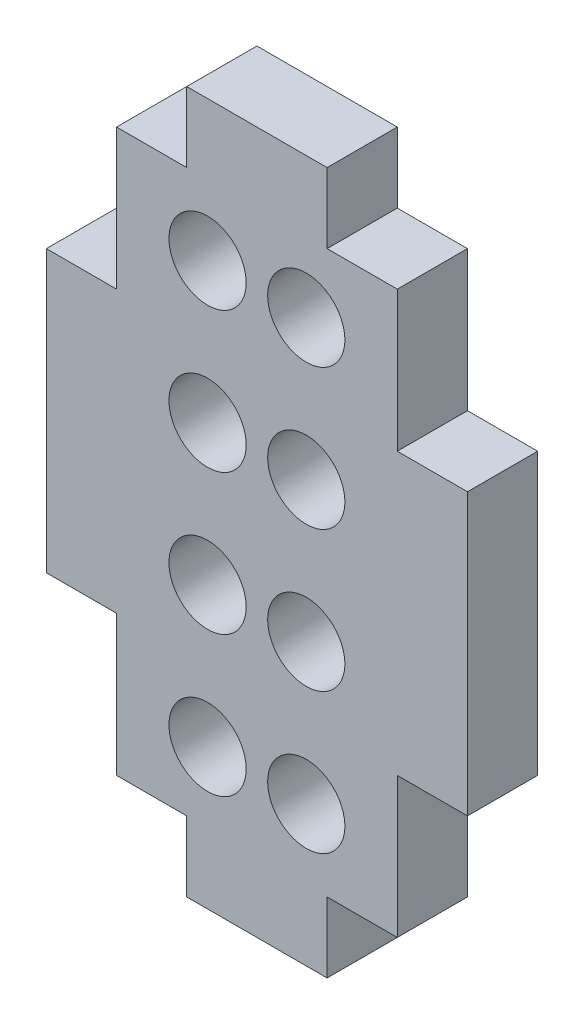
ISO-10303-21;
HEADER;
FILE_DESCRIPTION(('STEP AP214'),'2;1');
FILE_NAME('part.step','',(''),(''),'','','');
FILE_SCHEMA(('AUTOMOTIVE_DESIGN { 1 0 10303 214 1 1 1 1 }'));
ENDSEC;
DATA;
#1=APPLICATION_CONTEXT('core data for automotive mechanical design processes');
#2=APPLICATION_PROTOCOL_DEFINITION('international standard','automotive_design',2000,#1);
#3=PRODUCT_CONTEXT('',#1,'mechanical');
#4=PRODUCT('Part','Part','',(#3));
#5=PRODUCT_RELATED_PRODUCT_CATEGORY('part','',(#4));
#6=PRODUCT_DEFINITION_FORMATION('','',#4);
#7=PRODUCT_DEFINITION_CONTEXT('part definition',#1,'design');
#8=PRODUCT_DEFINITION('design','',#6,#7);
#9=PRODUCT_DEFINITION_SHAPE('','',#8);
#10=(LENGTH_UNIT() NAMED_UNIT(*) SI_UNIT(.MILLI.,.METRE.));
#11=(NAMED_UNIT(*) PLANE_ANGLE_UNIT() SI_UNIT($,.RADIAN.));
#12=(NAMED_UNIT(*) SI_UNIT($,.STERADIAN.) SOLID_ANGLE_UNIT());
#13=UNCERTAINTY_MEASURE_WITH_UNIT(LENGTH_MEASURE(1.E-05),#10,'distance_accuracy_value','');
#14=(GEOMETRIC_REPRESENTATION_CONTEXT(3) GLOBAL_UNCERTAINTY_ASSIGNED_CONTEXT((#13)) GLOBAL_UNIT_ASSIGNED_CONTEXT((#10,
#11,#12)) REPRESENTATION_CONTEXT('',''));
#15=CARTESIAN_POINT('',(0.,0.,0.));
#16=DIRECTION('',(0.,0.,1.));
#17=DIRECTION('',(1.,0.,0.));
#18=AXIS2_PLACEMENT_3D('',#15,#16,#17);
#19=CARTESIAN_POINT('',(12.9990004631941,5.51527459755107,5.));
#20=DIRECTION('',(0.,-1.,0.));
#21=DIRECTION('',(0.,0.,-1.));
#22=AXIS2_PLACEMENT_3D('',#19,#20,#21);
#23=PLANE('',#22);
#24=DIRECTION('',(-1.,0.,0.));
#25=VECTOR('',#24,1.);
#26=CARTESIAN_POINT('',(12.9990004631941,5.51527459755107,0.));
#27=LINE('',#26,#25);
#28=CARTESIAN_POINT('',(17.9990004631941,5.51527459755107,0.));
#29=VERTEX_POINT('',#28);
#30=CARTESIAN_POINT('',(12.9990004631941,5.51527459755107,0.));
#31=VERTEX_POINT('',#30);
#32=EDGE_CURVE('E216',#29,#31,#27,.T.);
#33=ORIENTED_EDGE('',*,*,#32,.T.);
#34=DIRECTION('',(0.,0.,-1.));
#35=VECTOR('',#34,1.);
#36=CARTESIAN_POINT('',(12.9990004631941,5.51527459755107,5.));
#37=LINE('',#36,#35);
#38=CARTESIAN_POINT('',(12.9990004631941,5.51527459755107,5.));
#39=VERTEX_POINT('',#38);
#40=EDGE_CURVE('E11',#39,#31,#37,.T.);
#41=ORIENTED_EDGE('',*,*,#40,.F.);
#42=DIRECTION('',(-1.,0.,0.));
#43=VECTOR('',#42,1.);
#44=CARTESIAN_POINT('',(12.9990004631941,5.51527459755107,5.));
#45=LINE('',#44,#43);
#46=CARTESIAN_POINT('',(17.9990004631941,5.51527459755107,5.));
#47=VERTEX_POINT('',#46);
#48=EDGE_CURVE('E275',#47,#39,#45,.T.);
#49=ORIENTED_EDGE('',*,*,#48,.F.);
#50=DIRECTION('',(0.,0.,-1.));
#51=VECTOR('',#50,1.);
#52=CARTESIAN_POINT('',(17.9990004631941,5.51527459755107,5.));
#53=LINE('',#52,#51);
#54=EDGE_CURVE('E212',#47,#29,#53,.T.);
#55=ORIENTED_EDGE('',*,*,#54,.T.);
#56=EDGE_LOOP('',(#33,#41,#49,#55));
#57=FACE_BOUND('',#56,.T.);
#58=ADVANCED_FACE('F43',(#57),#23,.F.);
#59=CARTESIAN_POINT('',(12.9990004631941,-14.4847254024489,5.));
#60=DIRECTION('',(1.,0.,0.));
#61=DIRECTION('',(0.,0.,-1.));
#62=AXIS2_PLACEMENT_3D('',#59,#60,#61);
#63=PLANE('',#62);
#64=DIRECTION('',(0.,-1.,0.));
#65=VECTOR('',#64,1.);
#66=CARTESIAN_POINT('',(12.9990004631941,-14.4847254024489,0.));
#67=LINE('',#66,#65);
#68=CARTESIAN_POINT('',(12.9990004631941,-14.4847254024489,0.));
#69=VERTEX_POINT('',#68);
#70=EDGE_CURVE('E220',#31,#69,#67,.T.);
#71=ORIENTED_EDGE('',*,*,#70,.T.);
#72=DIRECTION('',(0.,0.,-1.));
#73=VECTOR('',#72,1.);
#74=CARTESIAN_POINT('',(12.9990004631941,-14.4847254024489,5.));
#75=LINE('',#74,#73);
#76=CARTESIAN_POINT('',(12.9990004631941,-14.4847254024489,5.));
#77=VERTEX_POINT('',#76);
#78=EDGE_CURVE('E52',#77,#69,#75,.T.);
#79=ORIENTED_EDGE('',*,*,#78,.F.);
#80=DIRECTION('',(0.,-1.,0.));
#81=VECTOR('',#80,1.);
#82=CARTESIAN_POINT('',(12.9990004631941,-14.4847254024489,5.));
#83=LINE('',#82,#81);
#84=EDGE_CURVE('E139',#39,#77,#83,.T.);
#85=ORIENTED_EDGE('',*,*,#84,.F.);
#86=ORIENTED_EDGE('',*,*,#40,.T.);
#87=EDGE_LOOP('',(#71,#79,#85,#86));
#88=FACE_BOUND('',#87,.T.);
#89=ADVANCED_FACE('F426',(#88),#63,.F.);
#90=CARTESIAN_POINT('',(17.9990004631941,-14.4847254024489,5.));
#91=DIRECTION('',(0.,1.,0.));
#92=DIRECTION('',(0.,0.,1.));
#93=AXIS2_PLACEMENT_3D('',#90,#91,#92);
#94=PLANE('',#93);
#95=DIRECTION('',(1.,0.,0.));
#96=VECTOR('',#95,1.);
#97=CARTESIAN_POINT('',(17.9990004631941,-14.4847254024489,0.));
#98=LINE('',#97,#96);
#99=CARTESIAN_POINT('',(17.9990004631941,-14.4847254024489,0.));
#100=VERTEX_POINT('',#99);
#101=EDGE_CURVE('E224',#69,#100,#98,.T.);
#102=ORIENTED_EDGE('',*,*,#101,.T.);
#103=DIRECTION('',(0.,0.,-1.));
#104=VECTOR('',#103,1.);
#105=CARTESIAN_POINT('',(17.9990004631941,-14.4847254024489,5.));
#106=LINE('',#105,#104);
#107=CARTESIAN_POINT('',(17.9990004631941,-14.4847254024489,5.));
#108=VERTEX_POINT('',#107);
#109=EDGE_CURVE('E334',#108,#100,#106,.T.);
#110=ORIENTED_EDGE('',*,*,#109,.F.);
#111=DIRECTION('',(1.,0.,0.));
#112=VECTOR('',#111,1.);
#113=CARTESIAN_POINT('',(17.9990004631941,-14.4847254024489,5.));
#114=LINE('',#113,#112);
#115=EDGE_CURVE('E344',#77,#108,#114,.T.);
#116=ORIENTED_EDGE('',*,*,#115,.F.);
#117=ORIENTED_EDGE('',*,*,#78,.T.);
#118=EDGE_LOOP('',(#102,#110,#116,#117));
#119=FACE_BOUND('',#118,.T.);
#120=ADVANCED_FACE('F342',(#119),#94,.F.);
#121=CARTESIAN_POINT('',(17.9990004631941,-24.4847254024489,5.));
#122=DIRECTION('',(1.,0.,0.));
#123=DIRECTION('',(0.,0.,-1.));
#124=AXIS2_PLACEMENT_3D('',#121,#122,#123);
#125=PLANE('',#124);
#126=DIRECTION('',(0.,-1.,0.));
#127=VECTOR('',#126,1.);
#128=CARTESIAN_POINT('',(17.9990004631941,-24.4847254024489,0.));
#129=LINE('',#128,#127);
#130=CARTESIAN_POINT('',(17.9990004631941,-24.4847254024489,0.));
#131=VERTEX_POINT('',#130);
#132=EDGE_CURVE('E227',#100,#131,#129,.T.);
#133=ORIENTED_EDGE('',*,*,#132,.T.);
#134=DIRECTION('',(0.,0.,-1.));
#135=VECTOR('',#134,1.);
#136=CARTESIAN_POINT('',(17.9990004631941,-24.4847254024489,5.));
#137=LINE('',#136,#135);
#138=CARTESIAN_POINT('',(17.9990004631941,-24.4847254024489,5.));
#139=VERTEX_POINT('',#138);
#140=EDGE_CURVE('E330',#139,#131,#137,.T.);
#141=ORIENTED_EDGE('',*,*,#140,.F.);
#142=DIRECTION('',(0.,-1.,0.));
#143=VECTOR('',#142,1.);
#144=CARTESIAN_POINT('',(17.9990004631941,-24.4847254024489,5.));
#145=LINE('',#144,#143);
#146=EDGE_CURVE('E363',#108,#139,#145,.T.);
#147=ORIENTED_EDGE('',*,*,#146,.F.);
#148=ORIENTED_EDGE('',*,*,#109,.T.);
#149=EDGE_LOOP('',(#133,#141,#147,#148));
#150=FACE_BOUND('',#149,.T.);
#151=ADVANCED_FACE('F353',(#150),#125,.F.);
#152=CARTESIAN_POINT('',(22.9990004631945,-24.4847254024489,5.));
#153=DIRECTION('',(0.,1.,0.));
#154=DIRECTION('',(0.,0.,1.));
#155=AXIS2_PLACEMENT_3D('',#152,#153,#154);
#156=PLANE('',#155);
#157=DIRECTION('',(1.,0.,0.));
#158=VECTOR('',#157,1.);
#159=CARTESIAN_POINT('',(22.9990004631945,-24.4847254024489,0.));
#160=LINE('',#159,#158);
#161=CARTESIAN_POINT('',(22.9990004631945,-24.4847254024489,0.));
#162=VERTEX_POINT('',#161);
#163=EDGE_CURVE('E230',#131,#162,#160,.T.);
#164=ORIENTED_EDGE('',*,*,#163,.T.);
#165=DIRECTION('',(0.,0.,-1.));
#166=VECTOR('',#165,1.);
#167=CARTESIAN_POINT('',(22.9990004631945,-24.4847254024489,5.));
#168=LINE('',#167,#166);
#169=CARTESIAN_POINT('',(22.9990004631945,-24.4847254024489,5.));
#170=VERTEX_POINT('',#169);
#171=EDGE_CURVE('E326',#170,#162,#168,.T.);
#172=ORIENTED_EDGE('',*,*,#171,.F.);
#173=DIRECTION('',(1.,0.,0.));
#174=VECTOR('',#173,1.);
#175=CARTESIAN_POINT('',(22.9990004631945,-24.4847254024489,5.));
#176=LINE('',#175,#174);
#177=EDGE_CURVE('E359',#139,#170,#176,.T.);
#178=ORIENTED_EDGE('',*,*,#177,.F.);
#179=ORIENTED_EDGE('',*,*,#140,.T.);
#180=EDGE_LOOP('',(#164,#172,#178,#179));
#181=FACE_BOUND('',#180,.T.);
#182=ADVANCED_FACE('F357',(#181),#156,.F.);
#183=CARTESIAN_POINT('',(22.9990004631945,-29.4847254024489,5.));
#184=DIRECTION('',(1.,0.,0.));
#185=DIRECTION('',(0.,0.,-1.));
#186=AXIS2_PLACEMENT_3D('',#183,#184,#185);
#187=PLANE('',#186);
#188=DIRECTION('',(0.,-1.,0.));
#189=VECTOR('',#188,1.);
#190=CARTESIAN_POINT('',(22.9990004631945,-29.4847254024489,0.));
#191=LINE('',#190,#189);
#192=CARTESIAN_POINT('',(22.9990004631945,-29.4847254024489,0.));
#193=VERTEX_POINT('',#192);
#194=EDGE_CURVE('E233',#162,#193,#191,.T.);
#195=ORIENTED_EDGE('',*,*,#194,.T.);
#196=DIRECTION('',(0.,0.,-1.));
#197=VECTOR('',#196,1.);
#198=CARTESIAN_POINT('',(22.9990004631945,-29.4847254024489,5.));
#199=LINE('',#198,#197);
#200=CARTESIAN_POINT('',(22.9990004631945,-29.4847254024489,5.));
#201=VERTEX_POINT('',#200);
#202=EDGE_CURVE('E322',#201,#193,#199,.T.);
#203=ORIENTED_EDGE('',*,*,#202,.F.);
#204=DIRECTION('',(0.,-1.,0.));
#205=VECTOR('',#204,1.);
#206=CARTESIAN_POINT('',(22.9990004631945,-29.4847254024489,5.));
#207=LINE('',#206,#205);
#208=EDGE_CURVE('E362',#170,#201,#207,.T.);
#209=ORIENTED_EDGE('',*,*,#208,.F.);
#210=ORIENTED_EDGE('',*,*,#171,.T.);
#211=EDGE_LOOP('',(#195,#203,#209,#210));
#212=FACE_BOUND('',#211,.T.);
#213=ADVANCED_FACE('F439',(#212),#187,.F.);
#214=CARTESIAN_POINT('',(22.9990004631945,-29.4847254024489,5.));
#215=DIRECTION('',(0.,1.,0.));
#216=DIRECTION('',(0.,0.,1.));
#217=AXIS2_PLACEMENT_3D('',#214,#215,#216);
#218=PLANE('',#217);
#219=DIRECTION('',(1.,0.,0.));
#220=VECTOR('',#219,1.);
#221=CARTESIAN_POINT('',(22.9990004631945,-29.4847254024489,0.));
#222=LINE('',#221,#220);
#223=CARTESIAN_POINT('',(32.9990004631945,-29.4847254024489,0.));
#224=VERTEX_POINT('',#223);
#225=EDGE_CURVE('E236',#193,#224,#222,.T.);
#226=ORIENTED_EDGE('',*,*,#225,.T.);
#227=DIRECTION('',(0.,0.,-1.));
#228=VECTOR('',#227,1.);
#229=CARTESIAN_POINT('',(32.9990004631945,-29.4847254024489,5.));
#230=LINE('',#229,#228);
#231=CARTESIAN_POINT('',(32.9990004631945,-29.4847254024489,5.));
#232=VERTEX_POINT('',#231);
#233=EDGE_CURVE('E318',#232,#224,#230,.T.);
#234=ORIENTED_EDGE('',*,*,#233,.F.);
#235=DIRECTION('',(1.,0.,0.));
#236=VECTOR('',#235,1.);
#237=CARTESIAN_POINT('',(22.9990004631945,-29.4847254024489,5.));
#238=LINE('',#237,#236);
#239=EDGE_CURVE('E367',#201,#232,#238,.T.);
#240=ORIENTED_EDGE('',*,*,#239,.F.);
#241=ORIENTED_EDGE('',*,*,#202,.T.);
#242=EDGE_LOOP('',(#226,#234,#240,#241));
#243=FACE_BOUND('',#242,.T.);
#244=ADVANCED_FACE('F442',(#243),#218,.F.);
#245=CARTESIAN_POINT('',(32.9990004631945,-24.4847254024489,5.));
#246=DIRECTION('',(-1.,0.,0.));
#247=DIRECTION('',(0.,0.,1.));
#248=AXIS2_PLACEMENT_3D('',#245,#246,#247);
#249=PLANE('',#248);
#250=DIRECTION('',(0.,1.,0.));
#251=VECTOR('',#250,1.);
#252=CARTESIAN_POINT('',(32.9990004631945,-24.4847254024489,0.));
#253=LINE('',#252,#251);
#254=CARTESIAN_POINT('',(32.9990004631945,-24.4847254024489,0.));
#255=VERTEX_POINT('',#254);
#256=EDGE_CURVE('E239',#224,#255,#253,.T.);
#257=ORIENTED_EDGE('',*,*,#256,.T.);
#258=DIRECTION('',(0.,0.,-1.));
#259=VECTOR('',#258,1.);
#260=CARTESIAN_POINT('',(32.9990004631945,-24.4847254024489,5.));
#261=LINE('',#260,#259);
#262=CARTESIAN_POINT('',(32.9990004631945,-24.4847254024489,5.));
#263=VERTEX_POINT('',#262);
#264=EDGE_CURVE('E314',#263,#255,#261,.T.);
#265=ORIENTED_EDGE('',*,*,#264,.F.);
#266=DIRECTION('',(0.,1.,0.));
#267=VECTOR('',#266,1.);
#268=CARTESIAN_POINT('',(32.9990004631945,-24.4847254024489,5.));
#269=LINE('',#268,#267);
#270=EDGE_CURVE('E374',#232,#263,#269,.T.);
#271=ORIENTED_EDGE('',*,*,#270,.F.);
#272=ORIENTED_EDGE('',*,*,#233,.T.);
#273=EDGE_LOOP('',(#257,#265,#271,#272));
#274=FACE_BOUND('',#273,.T.);
#275=ADVANCED_FACE('F446',(#274),#249,.F.);
#276=CARTESIAN_POINT('',(37.9990004631941,-24.4847254024489,5.));
#277=DIRECTION('',(0.,1.,0.));
#278=DIRECTION('',(0.,0.,1.));
#279=AXIS2_PLACEMENT_3D('',#276,#277,#278);
#280=PLANE('',#279);
#281=DIRECTION('',(1.,0.,0.));
#282=VECTOR('',#281,1.);
#283=CARTESIAN_POINT('',(37.9990004631941,-24.4847254024489,0.));
#284=LINE('',#283,#282);
#285=CARTESIAN_POINT('',(37.9990004631941,-24.4847254024489,0.));
#286=VERTEX_POINT('',#285);
#287=EDGE_CURVE('E242',#255,#286,#284,.T.);
#288=ORIENTED_EDGE('',*,*,#287,.T.);
#289=DIRECTION('',(0.,0.,-1.));
#290=VECTOR('',#289,1.);
#291=CARTESIAN_POINT('',(37.9990004631941,-24.4847254024489,5.));
#292=LINE('',#291,#290);
#293=CARTESIAN_POINT('',(37.9990004631941,-24.4847254024489,5.));
#294=VERTEX_POINT('',#293);
#295=EDGE_CURVE('E310',#294,#286,#292,.T.);
#296=ORIENTED_EDGE('',*,*,#295,.F.);
#297=DIRECTION('',(1.,0.,0.));
#298=VECTOR('',#297,1.);
#299=CARTESIAN_POINT('',(37.9990004631941,-24.4847254024489,5.));
#300=LINE('',#299,#298);
#301=EDGE_CURVE('E377',#263,#294,#300,.T.);
#302=ORIENTED_EDGE('',*,*,#301,.F.);
#303=ORIENTED_EDGE('',*,*,#264,.T.);
#304=EDGE_LOOP('',(#288,#296,#302,#303));
#305=FACE_BOUND('',#304,.T.);
#306=ADVANCED_FACE('F450',(#305),#280,.F.);
#307=CARTESIAN_POINT('',(37.9990004631941,-14.4847254024489,5.));
#308=DIRECTION('',(-1.,0.,0.));
#309=DIRECTION('',(0.,0.,1.));
#310=AXIS2_PLACEMENT_3D('',#307,#308,#309);
#311=PLANE('',#310);
#312=DIRECTION('',(0.,1.,0.));
#313=VECTOR('',#312,1.);
#314=CARTESIAN_POINT('',(37.9990004631941,-14.4847254024489,0.));
#315=LINE('',#314,#313);
#316=CARTESIAN_POINT('',(37.9990004631941,-14.4847254024489,0.));
#317=VERTEX_POINT('',#316);
#318=EDGE_CURVE('E245',#286,#317,#315,.T.);
#319=ORIENTED_EDGE('',*,*,#318,.T.);
#320=DIRECTION('',(0.,0.,-1.));
#321=VECTOR('',#320,1.);
#322=CARTESIAN_POINT('',(37.9990004631941,-14.4847254024489,5.));
#323=LINE('',#322,#321);
#324=CARTESIAN_POINT('',(37.9990004631941,-14.4847254024489,5.));
#325=VERTEX_POINT('',#324);
#326=EDGE_CURVE('E306',#325,#317,#323,.T.);
#327=ORIENTED_EDGE('',*,*,#326,.F.);
#328=DIRECTION('',(0.,1.,0.));
#329=VECTOR('',#328,1.);
#330=CARTESIAN_POINT('',(37.9990004631941,-14.4847254024489,5.));
#331=LINE('',#330,#329);
#332=EDGE_CURVE('E380',#294,#325,#331,.T.);
#333=ORIENTED_EDGE('',*,*,#332,.F.);
#334=ORIENTED_EDGE('',*,*,#295,.T.);
#335=EDGE_LOOP('',(#319,#327,#333,#334));
#336=FACE_BOUND('',#335,.T.);
#337=ADVANCED_FACE('F454',(#336),#311,.F.);
#338=CARTESIAN_POINT('',(42.9990004631941,-14.4847254024489,5.));
#339=DIRECTION('',(0.,1.,0.));
#340=DIRECTION('',(0.,0.,1.));
#341=AXIS2_PLACEMENT_3D('',#338,#339,#340);
#342=PLANE('',#341);
#343=DIRECTION('',(1.,0.,0.));
#344=VECTOR('',#343,1.);
#345=CARTESIAN_POINT('',(42.9990004631941,-14.4847254024489,0.));
#346=LINE('',#345,#344);
#347=CARTESIAN_POINT('',(42.9990004631941,-14.4847254024489,0.));
#348=VERTEX_POINT('',#347);
#349=EDGE_CURVE('E248',#317,#348,#346,.T.);
#350=ORIENTED_EDGE('',*,*,#349,.T.);
#351=DIRECTION('',(0.,0.,-1.));
#352=VECTOR('',#351,1.);
#353=CARTESIAN_POINT('',(42.9990004631941,-14.4847254024489,5.));
#354=LINE('',#353,#352);
#355=CARTESIAN_POINT('',(42.9990004631941,-14.4847254024489,5.));
#356=VERTEX_POINT('',#355);
#357=EDGE_CURVE('E302',#356,#348,#354,.T.);
#358=ORIENTED_EDGE('',*,*,#357,.F.);
#359=DIRECTION('',(1.,0.,0.));
#360=VECTOR('',#359,1.);
#361=CARTESIAN_POINT('',(42.9990004631941,-14.4847254024489,5.));
#362=LINE('',#361,#360);
#363=EDGE_CURVE('E383',#325,#356,#362,.T.);
#364=ORIENTED_EDGE('',*,*,#363,.F.);
#365=ORIENTED_EDGE('',*,*,#326,.T.);
#366=EDGE_LOOP('',(#350,#358,#364,#365));
#367=FACE_BOUND('',#366,.T.);
#368=ADVANCED_FACE('F458',(#367),#342,.F.);
#369=CARTESIAN_POINT('',(42.9990004631941,5.51527459755107,5.));
#370=DIRECTION('',(-1.,0.,0.));
#371=DIRECTION('',(0.,0.,1.));
#372=AXIS2_PLACEMENT_3D('',#369,#370,#371);
#373=PLANE('',#372);
#374=DIRECTION('',(0.,1.,0.));
#375=VECTOR('',#374,1.);
#376=CARTESIAN_POINT('',(42.9990004631941,5.51527459755107,0.));
#377=LINE('',#376,#375);
#378=CARTESIAN_POINT('',(42.9990004631941,5.51527459755107,0.));
#379=VERTEX_POINT('',#378);
#380=EDGE_CURVE('E251',#348,#379,#377,.T.);
#381=ORIENTED_EDGE('',*,*,#380,.T.);
#382=DIRECTION('',(0.,0.,-1.));
#383=VECTOR('',#382,1.);
#384=CARTESIAN_POINT('',(42.9990004631941,5.51527459755107,5.));
#385=LINE('',#384,#383);
#386=CARTESIAN_POINT('',(42.9990004631941,5.51527459755107,5.));
#387=VERTEX_POINT('',#386);
#388=EDGE_CURVE('E298',#387,#379,#385,.T.);
#389=ORIENTED_EDGE('',*,*,#388,.F.);
#390=DIRECTION('',(0.,1.,0.));
#391=VECTOR('',#390,1.);
#392=CARTESIAN_POINT('',(42.9990004631941,5.51527459755107,5.));
#393=LINE('',#392,#391);
#394=EDGE_CURVE('E386',#356,#387,#393,.T.);
#395=ORIENTED_EDGE('',*,*,#394,.F.);
#396=ORIENTED_EDGE('',*,*,#357,.T.);
#397=EDGE_LOOP('',(#381,#389,#395,#396));
#398=FACE_BOUND('',#397,.T.);
#399=ADVANCED_FACE('F462',(#398),#373,.F.);
#400=CARTESIAN_POINT('',(37.9990004631941,5.51527459755107,5.));
#401=DIRECTION('',(0.,-1.,0.));
#402=DIRECTION('',(0.,0.,-1.));
#403=AXIS2_PLACEMENT_3D('',#400,#401,#402);
#404=PLANE('',#403);
#405=DIRECTION('',(-1.,0.,0.));
#406=VECTOR('',#405,1.);
#407=CARTESIAN_POINT('',(37.9990004631941,5.51527459755107,0.));
#408=LINE('',#407,#406);
#409=CARTESIAN_POINT('',(37.9990004631941,5.51527459755107,0.));
#410=VERTEX_POINT('',#409);
#411=EDGE_CURVE('E254',#379,#410,#408,.T.);
#412=ORIENTED_EDGE('',*,*,#411,.T.);
#413=DIRECTION('',(0.,0.,-1.));
#414=VECTOR('',#413,1.);
#415=CARTESIAN_POINT('',(37.9990004631941,5.51527459755107,5.));
#416=LINE('',#415,#414);
#417=CARTESIAN_POINT('',(37.9990004631941,5.51527459755107,5.));
#418=VERTEX_POINT('',#417);
#419=EDGE_CURVE('E294',#418,#410,#416,.T.);
#420=ORIENTED_EDGE('',*,*,#419,.F.);
#421=DIRECTION('',(-1.,0.,0.));
#422=VECTOR('',#421,1.);
#423=CARTESIAN_POINT('',(37.9990004631941,5.51527459755107,5.));
#424=LINE('',#423,#422);
#425=EDGE_CURVE('E389',#387,#418,#424,.T.);
#426=ORIENTED_EDGE('',*,*,#425,.F.);
#427=ORIENTED_EDGE('',*,*,#388,.T.);
#428=EDGE_LOOP('',(#412,#420,#426,#427));
#429=FACE_BOUND('',#428,.T.);
#430=ADVANCED_FACE('F466',(#429),#404,.F.);
#431=CARTESIAN_POINT('',(37.9990004631941,5.51527459755107,5.));
#432=DIRECTION('',(-1.,0.,0.));
#433=DIRECTION('',(0.,0.,1.));
#434=AXIS2_PLACEMENT_3D('',#431,#432,#433);
#435=PLANE('',#434);
#436=DIRECTION('',(0.,1.,0.));
#437=VECTOR('',#436,1.);
#438=CARTESIAN_POINT('',(37.9990004631941,5.51527459755107,0.));
#439=LINE('',#438,#437);
#440=CARTESIAN_POINT('',(37.9990004631941,15.5152745975511,0.));
#441=VERTEX_POINT('',#440);
#442=EDGE_CURVE('E257',#410,#441,#439,.T.);
#443=ORIENTED_EDGE('',*,*,#442,.T.);
#444=DIRECTION('',(0.,0.,-1.));
#445=VECTOR('',#444,1.);
#446=CARTESIAN_POINT('',(37.9990004631941,15.5152745975511,5.));
#447=LINE('',#446,#445);
#448=CARTESIAN_POINT('',(37.9990004631941,15.5152745975511,5.));
#449=VERTEX_POINT('',#448);
#450=EDGE_CURVE('E290',#449,#441,#447,.T.);
#451=ORIENTED_EDGE('',*,*,#450,.F.);
#452=DIRECTION('',(0.,1.,0.));
#453=VECTOR('',#452,1.);
#454=CARTESIAN_POINT('',(37.9990004631941,5.51527459755107,5.));
#455=LINE('',#454,#453);
#456=EDGE_CURVE('E392',#418,#449,#455,.T.);
#457=ORIENTED_EDGE('',*,*,#456,.F.);
#458=ORIENTED_EDGE('',*,*,#419,.T.);
#459=EDGE_LOOP('',(#443,#451,#457,#458));
#460=FACE_BOUND('',#459,.T.);
#461=ADVANCED_FACE('F470',(#460),#435,.F.);
#462=CARTESIAN_POINT('',(32.9990004631945,15.5152745975511,5.));
#463=DIRECTION('',(0.,-1.,0.));
#464=DIRECTION('',(0.,0.,-1.));
#465=AXIS2_PLACEMENT_3D('',#462,#463,#464);
#466=PLANE('',#465);
#467=DIRECTION('',(-1.,0.,0.));
#468=VECTOR('',#467,1.);
#469=CARTESIAN_POINT('',(32.9990004631945,15.5152745975511,0.));
#470=LINE('',#469,#468);
#471=CARTESIAN_POINT('',(32.9990004631945,15.5152745975511,0.));
#472=VERTEX_POINT('',#471);
#473=EDGE_CURVE('E260',#441,#472,#470,.T.);
#474=ORIENTED_EDGE('',*,*,#473,.T.);
#475=DIRECTION('',(0.,0.,-1.));
#476=VECTOR('',#475,1.);
#477=CARTESIAN_POINT('',(32.9990004631945,15.5152745975511,5.));
#478=LINE('',#477,#476);
#479=CARTESIAN_POINT('',(32.9990004631945,15.5152745975511,5.));
#480=VERTEX_POINT('',#479);
#481=EDGE_CURVE('E286',#480,#472,#478,.T.);
#482=ORIENTED_EDGE('',*,*,#481,.F.);
#483=DIRECTION('',(-1.,0.,0.));
#484=VECTOR('',#483,1.);
#485=CARTESIAN_POINT('',(32.9990004631945,15.5152745975511,5.));
#486=LINE('',#485,#484);
#487=EDGE_CURVE('E395',#449,#480,#486,.T.);
#488=ORIENTED_EDGE('',*,*,#487,.F.);
#489=ORIENTED_EDGE('',*,*,#450,.T.);
#490=EDGE_LOOP('',(#474,#482,#488,#489));
#491=FACE_BOUND('',#490,.T.);
#492=ADVANCED_FACE('F474',(#491),#466,.F.);
#493=CARTESIAN_POINT('',(32.9990004631945,20.5152745975511,5.));
#494=DIRECTION('',(-1.,0.,0.));
#495=DIRECTION('',(0.,0.,1.));
#496=AXIS2_PLACEMENT_3D('',#493,#494,#495);
#497=PLANE('',#496);
#498=DIRECTION('',(0.,1.,0.));
#499=VECTOR('',#498,1.);
#500=CARTESIAN_POINT('',(32.9990004631945,20.5152745975511,0.));
#501=LINE('',#500,#499);
#502=CARTESIAN_POINT('',(32.9990004631945,20.5152745975511,0.));
#503=VERTEX_POINT('',#502);
#504=EDGE_CURVE('E263',#472,#503,#501,.T.);
#505=ORIENTED_EDGE('',*,*,#504,.T.);
#506=DIRECTION('',(0.,0.,-1.));
#507=VECTOR('',#506,1.);
#508=CARTESIAN_POINT('',(32.9990004631945,20.5152745975511,5.));
#509=LINE('',#508,#507);
#510=CARTESIAN_POINT('',(32.9990004631945,20.5152745975511,5.));
#511=VERTEX_POINT('',#510);
#512=EDGE_CURVE('E282',#511,#503,#509,.T.);
#513=ORIENTED_EDGE('',*,*,#512,.F.);
#514=DIRECTION('',(0.,1.,0.));
#515=VECTOR('',#514,1.);
#516=CARTESIAN_POINT('',(32.9990004631945,20.5152745975511,5.));
#517=LINE('',#516,#515);
#518=EDGE_CURVE('E398',#480,#511,#517,.T.);
#519=ORIENTED_EDGE('',*,*,#518,.F.);
#520=ORIENTED_EDGE('',*,*,#481,.T.);
#521=EDGE_LOOP('',(#505,#513,#519,#520));
#522=FACE_BOUND('',#521,.T.);
#523=ADVANCED_FACE('F406',(#522),#497,.F.);
#524=CARTESIAN_POINT('',(22.9990004631945,20.5152745975511,5.));
#525=DIRECTION('',(0.,-1.,0.));
#526=DIRECTION('',(0.,0.,-1.));
#527=AXIS2_PLACEMENT_3D('',#524,#525,#526);
#528=PLANE('',#527);
#529=DIRECTION('',(-1.,0.,0.));
#530=VECTOR('',#529,1.);
#531=CARTESIAN_POINT('',(22.9990004631945,20.5152745975511,0.));
#532=LINE('',#531,#530);
#533=CARTESIAN_POINT('',(22.9990004631945,20.5152745975511,0.));
#534=VERTEX_POINT('',#533);
#535=EDGE_CURVE('E266',#503,#534,#532,.T.);
#536=ORIENTED_EDGE('',*,*,#535,.T.);
#537=DIRECTION('',(0.,0.,-1.));
#538=VECTOR('',#537,1.);
#539=CARTESIAN_POINT('',(22.9990004631945,20.5152745975511,5.));
#540=LINE('',#539,#538);
#541=CARTESIAN_POINT('',(22.9990004631945,20.5152745975511,5.));
#542=VERTEX_POINT('',#541);
#543=EDGE_CURVE('E205',#542,#534,#540,.T.);
#544=ORIENTED_EDGE('',*,*,#543,.F.);
#545=DIRECTION('',(-1.,0.,0.));
#546=VECTOR('',#545,1.);
#547=CARTESIAN_POINT('',(22.9990004631945,20.5152745975511,5.));
#548=LINE('',#547,#546);
#549=EDGE_CURVE('E194',#511,#542,#548,.T.);
#550=ORIENTED_EDGE('',*,*,#549,.F.);
#551=ORIENTED_EDGE('',*,*,#512,.T.);
#552=EDGE_LOOP('',(#536,#544,#550,#551));
#553=FACE_BOUND('',#552,.T.);
#554=ADVANCED_FACE('F410',(#553),#528,.F.);
#555=CARTESIAN_POINT('',(22.9990004631945,15.5152745975511,5.));
#556=DIRECTION('',(1.,0.,0.));
#557=DIRECTION('',(0.,0.,-1.));
#558=AXIS2_PLACEMENT_3D('',#555,#556,#557);
#559=PLANE('',#558);
#560=DIRECTION('',(0.,-1.,0.));
#561=VECTOR('',#560,1.);
#562=CARTESIAN_POINT('',(22.9990004631945,15.5152745975511,0.));
#563=LINE('',#562,#561);
#564=CARTESIAN_POINT('',(22.9990004631945,15.5152745975511,0.));
#565=VERTEX_POINT('',#564);
#566=EDGE_CURVE('E203',#534,#565,#563,.T.);
#567=ORIENTED_EDGE('',*,*,#566,.T.);
#568=DIRECTION('',(0.,0.,-1.));
#569=VECTOR('',#568,1.);
#570=CARTESIAN_POINT('',(22.9990004631945,15.5152745975511,5.));
#571=LINE('',#570,#569);
#572=CARTESIAN_POINT('',(22.9990004631945,15.5152745975511,5.));
#573=VERTEX_POINT('',#572);
#574=EDGE_CURVE('E200',#573,#565,#571,.T.);
#575=ORIENTED_EDGE('',*,*,#574,.F.);
#576=DIRECTION('',(0.,-1.,0.));
#577=VECTOR('',#576,1.);
#578=CARTESIAN_POINT('',(22.9990004631945,15.5152745975511,5.));
#579=LINE('',#578,#577);
#580=EDGE_CURVE('E188',#542,#573,#579,.T.);
#581=ORIENTED_EDGE('',*,*,#580,.F.);
#582=ORIENTED_EDGE('',*,*,#543,.T.);
#583=EDGE_LOOP('',(#567,#575,#581,#582));
#584=FACE_BOUND('',#583,.T.);
#585=ADVANCED_FACE('F201',(#584),#559,.F.);
#586=CARTESIAN_POINT('',(17.9990004631941,15.5152745975511,5.));
#587=DIRECTION('',(0.,-1.,0.));
#588=DIRECTION('',(0.,0.,-1.));
#589=AXIS2_PLACEMENT_3D('',#586,#587,#588);
#590=PLANE('',#589);
#591=DIRECTION('',(-1.,0.,0.));
#592=VECTOR('',#591,1.);
#593=CARTESIAN_POINT('',(17.9990004631941,15.5152745975511,0.));
#594=LINE('',#593,#592);
#595=CARTESIAN_POINT('',(17.9990004631941,15.5152745975511,0.));
#596=VERTEX_POINT('',#595);
#597=EDGE_CURVE('E125',#565,#596,#594,.T.);
#598=ORIENTED_EDGE('',*,*,#597,.T.);
#599=DIRECTION('',(0.,0.,-1.));
#600=VECTOR('',#599,1.);
#601=CARTESIAN_POINT('',(17.9990004631941,15.5152745975511,5.));
#602=LINE('',#601,#600);
#603=CARTESIAN_POINT('',(17.9990004631941,15.5152745975511,5.));
#604=VERTEX_POINT('',#603);
#605=EDGE_CURVE('E206',#604,#596,#602,.T.);
#606=ORIENTED_EDGE('',*,*,#605,.F.);
#607=DIRECTION('',(-1.,0.,0.));
#608=VECTOR('',#607,1.);
#609=CARTESIAN_POINT('',(17.9990004631941,15.5152745975511,5.));
#610=LINE('',#609,#608);
#611=EDGE_CURVE('E192',#573,#604,#610,.T.);
#612=ORIENTED_EDGE('',*,*,#611,.F.);
#613=ORIENTED_EDGE('',*,*,#574,.T.);
#614=EDGE_LOOP('',(#598,#606,#612,#613));
#615=FACE_BOUND('',#614,.T.);
#616=ADVANCED_FACE('F208',(#615),#590,.F.);
#617=CARTESIAN_POINT('',(17.9990004631941,5.51527459755107,5.));
#618=DIRECTION('',(1.,0.,0.));
#619=DIRECTION('',(0.,0.,-1.));
#620=AXIS2_PLACEMENT_3D('',#617,#618,#619);
#621=PLANE('',#620);
#622=DIRECTION('',(0.,-1.,0.));
#623=VECTOR('',#622,1.);
#624=CARTESIAN_POINT('',(17.9990004631941,5.51527459755107,0.));
#625=LINE('',#624,#623);
#626=EDGE_CURVE('E131',#596,#29,#625,.T.);
#627=ORIENTED_EDGE('',*,*,#626,.T.);
#628=ORIENTED_EDGE('',*,*,#54,.F.);
#629=DIRECTION('',(0.,-1.,0.));
#630=VECTOR('',#629,1.);
#631=CARTESIAN_POINT('',(17.9990004631941,5.51527459755107,5.));
#632=LINE('',#631,#630);
#633=EDGE_CURVE('E60',#604,#47,#632,.T.);
#634=ORIENTED_EDGE('',*,*,#633,.F.);
#635=ORIENTED_EDGE('',*,*,#605,.T.);
#636=EDGE_LOOP('',(#627,#628,#634,#635));
#637=FACE_BOUND('',#636,.T.);
#638=ADVANCED_FACE('F414',(#637),#621,.F.);
#639=CARTESIAN_POINT('',(0.,0.,5.));
#640=DIRECTION('',(0.,0.,1.));
#641=DIRECTION('',(1.,0.,0.));
#642=AXIS2_PLACEMENT_3D('',#639,#640,#641);
#643=PLANE('',#642);
#644=CARTESIAN_POINT('',(24.4838689203809,0.515274597551066,5.));
#645=DIRECTION('',(0.,0.,1.));
#646=DIRECTION('',(1.,0.,0.));
#647=AXIS2_PLACEMENT_3D('',#644,#645,#646);
#648=CIRCLE('',#647,2.75);
#649=CARTESIAN_POINT('',(27.2338689203809,0.515274597551066,5.));
#650=VERTEX_POINT('',#649);
#651=EDGE_CURVE('E758',#650,#650,#648,.T.);
#652=ORIENTED_EDGE('',*,*,#651,.F.);
#653=EDGE_LOOP('',(#652));
#654=FACE_BOUND('',#653,.T.);
#655=CARTESIAN_POINT('',(24.4838689203809,-9.48472540244893,5.));
#656=DIRECTION('',(0.,0.,1.));
#657=DIRECTION('',(1.,0.,0.));
#658=AXIS2_PLACEMENT_3D('',#655,#656,#657);
#659=CIRCLE('',#658,2.75);
#660=CARTESIAN_POINT('',(27.2338689203809,-9.48472540244893,5.));
#661=VERTEX_POINT('',#660);
#662=EDGE_CURVE('E766',#661,#661,#659,.T.);
#663=ORIENTED_EDGE('',*,*,#662,.F.);
#664=EDGE_LOOP('',(#663));
#665=FACE_BOUND('',#664,.T.);
#666=CARTESIAN_POINT('',(24.4838689203809,-19.4847254024489,5.));
#667=DIRECTION('',(0.,0.,1.));
#668=DIRECTION('',(1.,0.,0.));
#669=AXIS2_PLACEMENT_3D('',#666,#667,#668);
#670=CIRCLE('',#669,2.75);
#671=CARTESIAN_POINT('',(27.2338689203809,-19.4847254024489,5.));
#672=VERTEX_POINT('',#671);
#673=EDGE_CURVE('E779',#672,#672,#670,.T.);
#674=ORIENTED_EDGE('',*,*,#673,.F.);
#675=EDGE_LOOP('',(#674));
#676=FACE_BOUND('',#675,.T.);
#677=CARTESIAN_POINT('',(31.5141320060082,-19.4847254024489,5.));
#678=DIRECTION('',(0.,0.,1.));
#679=DIRECTION('',(-1.,0.,0.));
#680=AXIS2_PLACEMENT_3D('',#677,#678,#679);
#681=CIRCLE('',#680,2.74999999999999);
#682=CARTESIAN_POINT('',(28.7641320060082,-19.4847254024489,5.));
#683=VERTEX_POINT('',#682);
#684=EDGE_CURVE('E787',#683,#683,#681,.T.);
#685=ORIENTED_EDGE('',*,*,#684,.F.);
#686=EDGE_LOOP('',(#685));
#687=FACE_BOUND('',#686,.T.);
#688=CARTESIAN_POINT('',(31.5141320060082,-9.48472540244893,5.));
#689=DIRECTION('',(0.,0.,1.));
#690=DIRECTION('',(-1.,0.,0.));
#691=AXIS2_PLACEMENT_3D('',#688,#689,#690);
#692=CIRCLE('',#691,2.74999999999999);
#693=CARTESIAN_POINT('',(28.7641320060082,-9.48472540244893,5.));
#694=VERTEX_POINT('',#693);
#695=EDGE_CURVE('E795',#694,#694,#692,.T.);
#696=ORIENTED_EDGE('',*,*,#695,.F.);
#697=EDGE_LOOP('',(#696));
#698=FACE_BOUND('',#697,.T.);
#699=CARTESIAN_POINT('',(31.5141320060082,0.515274597551066,5.));
#700=DIRECTION('',(0.,0.,1.));
#701=DIRECTION('',(-1.,0.,0.));
#702=AXIS2_PLACEMENT_3D('',#699,#700,#701);
#703=CIRCLE('',#702,2.74999999999999);
#704=CARTESIAN_POINT('',(28.7641320060082,0.515274597551066,5.));
#705=VERTEX_POINT('',#704);
#706=EDGE_CURVE('E818',#705,#705,#703,.T.);
#707=ORIENTED_EDGE('',*,*,#706,.F.);
#708=EDGE_LOOP('',(#707));
#709=FACE_BOUND('',#708,.T.);
#710=CARTESIAN_POINT('',(31.5141320060082,10.5152745975511,5.));
#711=DIRECTION('',(0.,0.,1.));
#712=DIRECTION('',(-1.,0.,0.));
#713=AXIS2_PLACEMENT_3D('',#710,#711,#712);
#714=CIRCLE('',#713,2.74999999999999);
#715=CARTESIAN_POINT('',(28.7641320060082,10.5152745975511,5.));
#716=VERTEX_POINT('',#715);
#717=EDGE_CURVE('E827',#716,#716,#714,.T.);
#718=ORIENTED_EDGE('',*,*,#717,.F.);
#719=EDGE_LOOP('',(#718));
#720=FACE_BOUND('',#719,.T.);
#721=CARTESIAN_POINT('',(24.4838689203809,10.5152745975511,5.));
#722=DIRECTION('',(0.,0.,1.));
#723=DIRECTION('',(1.,0.,0.));
#724=AXIS2_PLACEMENT_3D('',#721,#722,#723);
#725=CIRCLE('',#724,2.75);
#726=CARTESIAN_POINT('',(27.2338689203809,10.5152745975511,5.));
#727=VERTEX_POINT('',#726);
#728=EDGE_CURVE('E760',#727,#727,#725,.T.);
#729=ORIENTED_EDGE('',*,*,#728,.F.);
#730=EDGE_LOOP('',(#729));
#731=FACE_BOUND('',#730,.T.);
#732=ORIENTED_EDGE('',*,*,#48,.T.);
#733=ORIENTED_EDGE('',*,*,#84,.T.);
#734=ORIENTED_EDGE('',*,*,#115,.T.);
#735=ORIENTED_EDGE('',*,*,#146,.T.);
#736=ORIENTED_EDGE('',*,*,#177,.T.);
#737=ORIENTED_EDGE('',*,*,#208,.T.);
#738=ORIENTED_EDGE('',*,*,#239,.T.);
#739=ORIENTED_EDGE('',*,*,#270,.T.);
#740=ORIENTED_EDGE('',*,*,#301,.T.);
#741=ORIENTED_EDGE('',*,*,#332,.T.);
#742=ORIENTED_EDGE('',*,*,#363,.T.);
#743=ORIENTED_EDGE('',*,*,#394,.T.);
#744=ORIENTED_EDGE('',*,*,#425,.T.);
#745=ORIENTED_EDGE('',*,*,#456,.T.);
#746=ORIENTED_EDGE('',*,*,#487,.T.);
#747=ORIENTED_EDGE('',*,*,#518,.T.);
#748=ORIENTED_EDGE('',*,*,#549,.T.);
#749=ORIENTED_EDGE('',*,*,#580,.T.);
#750=ORIENTED_EDGE('',*,*,#611,.T.);
#751=ORIENTED_EDGE('',*,*,#633,.T.);
#752=EDGE_LOOP('',(#732,#733,#734,#735,#736,#737,#738,#739,#740,#741,#742,#743,#744,#745,#746,
#747,#748,#749,#750,#751));
#753=FACE_BOUND('',#752,.T.);
#754=ADVANCED_FACE('F190',(#654,#665,#676,#687,#698,#709,#720,#731,#753),#643,.T.);
#755=CARTESIAN_POINT('',(0.,0.,0.));
#756=DIRECTION('',(0.,0.,1.));
#757=DIRECTION('',(1.,0.,0.));
#758=AXIS2_PLACEMENT_3D('',#755,#756,#757);
#759=PLANE('',#758);
#760=CARTESIAN_POINT('',(24.4838689203809,0.515274597551066,0.));
#761=DIRECTION('',(0.,0.,1.));
#762=DIRECTION('',(1.,0.,0.));
#763=AXIS2_PLACEMENT_3D('',#760,#761,#762);
#764=CIRCLE('',#763,2.75);
#765=CARTESIAN_POINT('',(27.2338689203809,0.515274597551066,0.));
#766=VERTEX_POINT('',#765);
#767=EDGE_CURVE('E755',#766,#766,#764,.T.);
#768=ORIENTED_EDGE('',*,*,#767,.T.);
#769=EDGE_LOOP('',(#768));
#770=FACE_BOUND('',#769,.T.);
#771=CARTESIAN_POINT('',(24.4838689203809,-9.48472540244893,0.));
#772=DIRECTION('',(0.,0.,1.));
#773=DIRECTION('',(1.,0.,0.));
#774=AXIS2_PLACEMENT_3D('',#771,#772,#773);
#775=CIRCLE('',#774,2.75);
#776=CARTESIAN_POINT('',(27.2338689203809,-9.48472540244893,0.));
#777=VERTEX_POINT('',#776);
#778=EDGE_CURVE('E775',#777,#777,#775,.T.);
#779=ORIENTED_EDGE('',*,*,#778,.T.);
#780=EDGE_LOOP('',(#779));
#781=FACE_BOUND('',#780,.T.);
#782=CARTESIAN_POINT('',(24.4838689203809,-19.4847254024489,0.));
#783=DIRECTION('',(0.,0.,1.));
#784=DIRECTION('',(1.,0.,0.));
#785=AXIS2_PLACEMENT_3D('',#782,#783,#784);
#786=CIRCLE('',#785,2.75);
#787=CARTESIAN_POINT('',(27.2338689203809,-19.4847254024489,0.));
#788=VERTEX_POINT('',#787);
#789=EDGE_CURVE('E783',#788,#788,#786,.T.);
#790=ORIENTED_EDGE('',*,*,#789,.T.);
#791=EDGE_LOOP('',(#790));
#792=FACE_BOUND('',#791,.T.);
#793=CARTESIAN_POINT('',(31.5141320060082,-19.4847254024489,0.));
#794=DIRECTION('',(0.,0.,1.));
#795=DIRECTION('',(-1.,0.,0.));
#796=AXIS2_PLACEMENT_3D('',#793,#794,#795);
#797=CIRCLE('',#796,2.74999999999999);
#798=CARTESIAN_POINT('',(28.7641320060082,-19.4847254024489,0.));
#799=VERTEX_POINT('',#798);
#800=EDGE_CURVE('E791',#799,#799,#797,.T.);
#801=ORIENTED_EDGE('',*,*,#800,.T.);
#802=EDGE_LOOP('',(#801));
#803=FACE_BOUND('',#802,.T.);
#804=CARTESIAN_POINT('',(31.5141320060082,-9.48472540244893,0.));
#805=DIRECTION('',(0.,0.,1.));
#806=DIRECTION('',(-1.,0.,0.));
#807=AXIS2_PLACEMENT_3D('',#804,#805,#806);
#808=CIRCLE('',#807,2.74999999999999);
#809=CARTESIAN_POINT('',(28.7641320060082,-9.48472540244893,0.));
#810=VERTEX_POINT('',#809);
#811=EDGE_CURVE('E812',#810,#810,#808,.T.);
#812=ORIENTED_EDGE('',*,*,#811,.T.);
#813=EDGE_LOOP('',(#812));
#814=FACE_BOUND('',#813,.T.);
#815=CARTESIAN_POINT('',(31.5141320060082,0.515274597551066,0.));
#816=DIRECTION('',(0.,0.,1.));
#817=DIRECTION('',(-1.,0.,0.));
#818=AXIS2_PLACEMENT_3D('',#815,#816,#817);
#819=CIRCLE('',#818,2.74999999999999);
#820=CARTESIAN_POINT('',(28.7641320060082,0.515274597551066,0.));
#821=VERTEX_POINT('',#820);
#822=EDGE_CURVE('E824',#821,#821,#819,.T.);
#823=ORIENTED_EDGE('',*,*,#822,.T.);
#824=EDGE_LOOP('',(#823));
#825=FACE_BOUND('',#824,.T.);
#826=CARTESIAN_POINT('',(31.5141320060082,10.5152745975511,0.));
#827=DIRECTION('',(0.,0.,1.));
#828=DIRECTION('',(-1.,0.,0.));
#829=AXIS2_PLACEMENT_3D('',#826,#827,#828);
#830=CIRCLE('',#829,2.74999999999999);
#831=CARTESIAN_POINT('',(28.7641320060082,10.5152745975511,0.));
#832=VERTEX_POINT('',#831);
#833=EDGE_CURVE('E769',#832,#832,#830,.T.);
#834=ORIENTED_EDGE('',*,*,#833,.T.);
#835=EDGE_LOOP('',(#834));
#836=FACE_BOUND('',#835,.T.);
#837=CARTESIAN_POINT('',(24.4838689203809,10.5152745975511,0.));
#838=DIRECTION('',(0.,0.,1.));
#839=DIRECTION('',(1.,0.,0.));
#840=AXIS2_PLACEMENT_3D('',#837,#838,#839);
#841=CIRCLE('',#840,2.75);
#842=CARTESIAN_POINT('',(27.2338689203809,10.5152745975511,0.));
#843=VERTEX_POINT('',#842);
#844=EDGE_CURVE('E221',#843,#843,#841,.T.);
#845=ORIENTED_EDGE('',*,*,#844,.T.);
#846=EDGE_LOOP('',(#845));
#847=FACE_BOUND('',#846,.T.);
#848=ORIENTED_EDGE('',*,*,#32,.F.);
#849=ORIENTED_EDGE('',*,*,#626,.F.);
#850=ORIENTED_EDGE('',*,*,#597,.F.);
#851=ORIENTED_EDGE('',*,*,#566,.F.);
#852=ORIENTED_EDGE('',*,*,#535,.F.);
#853=ORIENTED_EDGE('',*,*,#504,.F.);
#854=ORIENTED_EDGE('',*,*,#473,.F.);
#855=ORIENTED_EDGE('',*,*,#442,.F.);
#856=ORIENTED_EDGE('',*,*,#411,.F.);
#857=ORIENTED_EDGE('',*,*,#380,.F.);
#858=ORIENTED_EDGE('',*,*,#349,.F.);
#859=ORIENTED_EDGE('',*,*,#318,.F.);
#860=ORIENTED_EDGE('',*,*,#287,.F.);
#861=ORIENTED_EDGE('',*,*,#256,.F.);
#862=ORIENTED_EDGE('',*,*,#225,.F.);
#863=ORIENTED_EDGE('',*,*,#194,.F.);
#864=ORIENTED_EDGE('',*,*,#163,.F.);
#865=ORIENTED_EDGE('',*,*,#132,.F.);
#866=ORIENTED_EDGE('',*,*,#101,.F.);
#867=ORIENTED_EDGE('',*,*,#70,.F.);
#868=EDGE_LOOP('',(#848,#849,#850,#851,#852,#853,#854,#855,#856,#857,#858,#859,#860,#861,#862,
#863,#864,#865,#866,#867));
#869=FACE_BOUND('',#868,.T.);
#870=ADVANCED_FACE('F348',(#770,#781,#792,#803,#814,#825,#836,#847,#869),#759,.F.);
#871=CARTESIAN_POINT('',(24.4838689203809,10.5152745975511,0.));
#872=DIRECTION('',(0.,0.,1.));
#873=DIRECTION('',(1.,0.,0.));
#874=AXIS2_PLACEMENT_3D('',#871,#872,#873);
#875=CYLINDRICAL_SURFACE('',#874,2.75);
#876=ORIENTED_EDGE('',*,*,#844,.F.);
#877=EDGE_LOOP('',(#876));
#878=FACE_BOUND('',#877,.T.);
#879=ORIENTED_EDGE('',*,*,#728,.T.);
#880=EDGE_LOOP('',(#879));
#881=FACE_BOUND('',#880,.T.);
#882=ADVANCED_FACE('F514',(#878,#881),#875,.F.);
#883=CARTESIAN_POINT('',(31.5141320060082,10.5152745975511,0.));
#884=DIRECTION('',(0.,0.,1.));
#885=DIRECTION('',(1.,0.,0.));
#886=AXIS2_PLACEMENT_3D('',#883,#884,#885);
#887=CYLINDRICAL_SURFACE('',#886,2.74999999999999);
#888=ORIENTED_EDGE('',*,*,#833,.F.);
#889=EDGE_LOOP('',(#888));
#890=FACE_BOUND('',#889,.T.);
#891=ORIENTED_EDGE('',*,*,#717,.T.);
#892=EDGE_LOOP('',(#891));
#893=FACE_BOUND('',#892,.T.);
#894=ADVANCED_FACE('F524',(#890,#893),#887,.F.);
#895=CARTESIAN_POINT('',(31.5141320060082,0.515274597551066,0.));
#896=DIRECTION('',(0.,0.,1.));
#897=DIRECTION('',(1.,0.,0.));
#898=AXIS2_PLACEMENT_3D('',#895,#896,#897);
#899=CYLINDRICAL_SURFACE('',#898,2.74999999999999);
#900=ORIENTED_EDGE('',*,*,#822,.F.);
#901=EDGE_LOOP('',(#900));
#902=FACE_BOUND('',#901,.T.);
#903=ORIENTED_EDGE('',*,*,#706,.T.);
#904=EDGE_LOOP('',(#903));
#905=FACE_BOUND('',#904,.T.);
#906=ADVANCED_FACE('F535',(#902,#905),#899,.F.);
#907=CARTESIAN_POINT('',(31.5141320060082,-9.48472540244893,0.));
#908=DIRECTION('',(0.,0.,1.));
#909=DIRECTION('',(1.,0.,0.));
#910=AXIS2_PLACEMENT_3D('',#907,#908,#909);
#911=CYLINDRICAL_SURFACE('',#910,2.74999999999999);
#912=ORIENTED_EDGE('',*,*,#811,.F.);
#913=EDGE_LOOP('',(#912));
#914=FACE_BOUND('',#913,.T.);
#915=ORIENTED_EDGE('',*,*,#695,.T.);
#916=EDGE_LOOP('',(#915));
#917=FACE_BOUND('',#916,.T.);
#918=ADVANCED_FACE('F546',(#914,#917),#911,.F.);
#919=CARTESIAN_POINT('',(31.5141320060082,-19.4847254024489,0.));
#920=DIRECTION('',(0.,0.,1.));
#921=DIRECTION('',(1.,0.,0.));
#922=AXIS2_PLACEMENT_3D('',#919,#920,#921);
#923=CYLINDRICAL_SURFACE('',#922,2.74999999999999);
#924=ORIENTED_EDGE('',*,*,#800,.F.);
#925=EDGE_LOOP('',(#924));
#926=FACE_BOUND('',#925,.T.);
#927=ORIENTED_EDGE('',*,*,#684,.T.);
#928=EDGE_LOOP('',(#927));
#929=FACE_BOUND('',#928,.T.);
#930=ADVANCED_FACE('F557',(#926,#929),#923,.F.);
#931=CARTESIAN_POINT('',(24.4838689203809,-19.4847254024489,0.));
#932=DIRECTION('',(0.,0.,1.));
#933=DIRECTION('',(1.,0.,0.));
#934=AXIS2_PLACEMENT_3D('',#931,#932,#933);
#935=CYLINDRICAL_SURFACE('',#934,2.75);
#936=ORIENTED_EDGE('',*,*,#789,.F.);
#937=EDGE_LOOP('',(#936));
#938=FACE_BOUND('',#937,.T.);
#939=ORIENTED_EDGE('',*,*,#673,.T.);
#940=EDGE_LOOP('',(#939));
#941=FACE_BOUND('',#940,.T.);
#942=ADVANCED_FACE('F568',(#938,#941),#935,.F.);
#943=CARTESIAN_POINT('',(24.4838689203809,-9.48472540244893,0.));
#944=DIRECTION('',(0.,0.,1.));
#945=DIRECTION('',(1.,0.,0.));
#946=AXIS2_PLACEMENT_3D('',#943,#944,#945);
#947=CYLINDRICAL_SURFACE('',#946,2.75);
#948=ORIENTED_EDGE('',*,*,#778,.F.);
#949=EDGE_LOOP('',(#948));
#950=FACE_BOUND('',#949,.T.);
#951=ORIENTED_EDGE('',*,*,#662,.T.);
#952=EDGE_LOOP('',(#951));
#953=FACE_BOUND('',#952,.T.);
#954=ADVANCED_FACE('F579',(#950,#953),#947,.F.);
#955=CARTESIAN_POINT('',(24.4838689203809,0.515274597551066,0.));
#956=DIRECTION('',(0.,0.,1.));
#957=DIRECTION('',(1.,0.,0.));
#958=AXIS2_PLACEMENT_3D('',#955,#956,#957);
#959=CYLINDRICAL_SURFACE('',#958,2.75);
#960=ORIENTED_EDGE('',*,*,#767,.F.);
#961=EDGE_LOOP('',(#960));
#962=FACE_BOUND('',#961,.T.);
#963=ORIENTED_EDGE('',*,*,#651,.T.);
#964=EDGE_LOOP('',(#963));
#965=FACE_BOUND('',#964,.T.);
#966=ADVANCED_FACE('F590',(#962,#965),#959,.F.);
#967=CLOSED_SHELL('',(#58,#89,#120,#151,#182,#213,#244,#275,#306,#337,#368,#399,#430,#461,#492,
#523,#554,#585,#616,#638,#754,#870,#882,#894,#906,#918,#930,#942,#954,#966));
#968=MANIFOLD_SOLID_BREP('B2',#967);
#969=ADVANCED_BREP_SHAPE_REPRESENTATION('',(#18,#968),#14);
#970=SHAPE_DEFINITION_REPRESENTATION(#9,#969);
ENDSEC;
END-ISO-10303-21;
